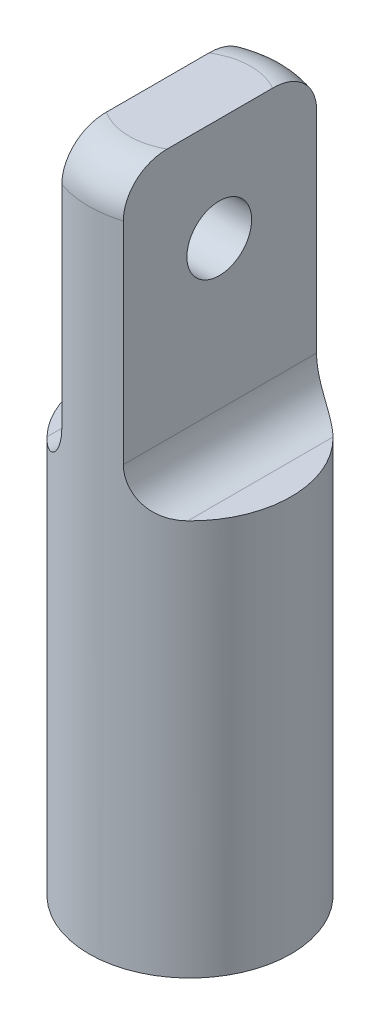
ISO-10303-21;
HEADER;
FILE_DESCRIPTION(('STEP AP214'),'2;1');
FILE_NAME('part.step','',(''),(''),'','','');
FILE_SCHEMA(('AUTOMOTIVE_DESIGN { 1 0 10303 214 1 1 1 1 }'));
ENDSEC;
DATA;
#1=APPLICATION_CONTEXT('core data for automotive mechanical design processes');
#2=APPLICATION_PROTOCOL_DEFINITION('international standard','automotive_design',2000,#1);
#3=PRODUCT_CONTEXT('',#1,'mechanical');
#4=PRODUCT('Part','Part','',(#3));
#5=PRODUCT_RELATED_PRODUCT_CATEGORY('part','',(#4));
#6=PRODUCT_DEFINITION_FORMATION('','',#4);
#7=PRODUCT_DEFINITION_CONTEXT('part definition',#1,'design');
#8=PRODUCT_DEFINITION('design','',#6,#7);
#9=PRODUCT_DEFINITION_SHAPE('','',#8);
#10=(LENGTH_UNIT() NAMED_UNIT(*) SI_UNIT(.MILLI.,.METRE.));
#11=(NAMED_UNIT(*) PLANE_ANGLE_UNIT() SI_UNIT($,.RADIAN.));
#12=(NAMED_UNIT(*) SI_UNIT($,.STERADIAN.) SOLID_ANGLE_UNIT());
#13=UNCERTAINTY_MEASURE_WITH_UNIT(LENGTH_MEASURE(1.E-05),#10,'distance_accuracy_value','');
#14=(GEOMETRIC_REPRESENTATION_CONTEXT(3) GLOBAL_UNCERTAINTY_ASSIGNED_CONTEXT((#13)) GLOBAL_UNIT_ASSIGNED_CONTEXT((#10,
#11,#12)) REPRESENTATION_CONTEXT('',''));
#15=CARTESIAN_POINT('',(0.,0.,0.));
#16=DIRECTION('',(0.,0.,1.));
#17=DIRECTION('',(1.,0.,0.));
#18=AXIS2_PLACEMENT_3D('',#15,#16,#17);
#19=CARTESIAN_POINT('',(0.,60.,0.));
#20=DIRECTION('',(0.,-1.,0.));
#21=DIRECTION('',(0.,0.,-1.));
#22=AXIS2_PLACEMENT_3D('',#19,#20,#21);
#23=CYLINDRICAL_SURFACE('',#22,12.5);
#24=CARTESIAN_POINT('',(0.,23.9298715770072,0.));
#25=DIRECTION('',(0.,-1.,0.));
#26=DIRECTION('',(0.,0.,-1.));
#27=AXIS2_PLACEMENT_3D('',#24,#25,#26);
#28=CIRCLE('',#27,12.5);
#29=CARTESIAN_POINT('',(-9.,23.9298715770072,8.67467578644874));
#30=VERTEX_POINT('',#29);
#31=CARTESIAN_POINT('',(-9.,23.9298715770072,-8.67467578644874));
#32=VERTEX_POINT('',#31);
#33=EDGE_CURVE('E124',#30,#32,#28,.T.);
#34=ORIENTED_EDGE('',*,*,#33,.T.);
#35=CARTESIAN_POINT('',(-9.,23.9298715770072,-8.67467578644874));
#36=CARTESIAN_POINT('',(-8.9263776286709,23.9298733845166,-8.75106038808621));
#37=CARTESIAN_POINT('',(-8.85178659319491,23.9314980512666,-8.82650063151235));
#38=CARTESIAN_POINT('',(-8.70077508893554,23.9382601700447,-8.97539753684047));
#39=CARTESIAN_POINT('',(-8.62435421897226,23.9433983993322,-9.04885375610449));
#40=CARTESIAN_POINT('',(-8.39219253302534,23.9645164930836,-9.26639666180418));
#41=CARTESIAN_POINT('',(-8.23390243978649,23.9862023240674,-9.40729479585523));
#42=CARTESIAN_POINT('',(-7.91148754098922,24.0470245387056,-9.68004089216879));
#43=CARTESIAN_POINT('',(-7.74733703942433,24.0862495852725,-9.81183889429091));
#44=CARTESIAN_POINT('',(-7.41646419139906,24.1841256707728,-10.0642556027873));
#45=CARTESIAN_POINT('',(-7.24974537887247,24.2427519562735,-10.1848883049295));
#46=CARTESIAN_POINT('',(-6.97038575234441,24.3587001142686,-10.3770196577235));
#47=CARTESIAN_POINT('',(-6.85763605260495,24.4103509869452,-10.4518220596143));
#48=CARTESIAN_POINT('',(-6.63341494727138,24.52362167251,-10.5955422155376));
#49=CARTESIAN_POINT('',(-6.52194322012928,24.5852389160916,-10.6644614792517));
#50=CARTESIAN_POINT('',(-6.30183264021777,24.7184126172311,-10.7959852263683));
#51=CARTESIAN_POINT('',(-6.19318591623376,24.789936894004,-10.8586090659511));
#52=CARTESIAN_POINT('',(-5.97964177064672,24.943056427888,-10.9776512848146));
#53=CARTESIAN_POINT('',(-5.87474431470996,25.024651592745,-11.0340697209308));
#54=CARTESIAN_POINT('',(-5.66947900461495,25.1981453180612,-11.1409366681128));
#55=CARTESIAN_POINT('',(-5.56913759932905,25.2900953482511,-11.1913525417588));
#56=CARTESIAN_POINT('',(-5.37488384435961,25.4835228694597,-11.2859336521199));
#57=CARTESIAN_POINT('',(-5.28097166513934,25.5850006129254,-11.3300987231354));
#58=CARTESIAN_POINT('',(-5.10073662928502,25.796962712423,-11.4123754806352));
#59=CARTESIAN_POINT('',(-5.0144214869899,25.9074560087962,-11.4504810450069));
#60=CARTESIAN_POINT('',(-4.85063397819677,26.1365604136835,-11.5208201952544));
#61=CARTESIAN_POINT('',(-4.77316097045812,26.2551709325293,-11.5530542070425));
#62=CARTESIAN_POINT('',(-4.63319717602147,26.4909218397659,-11.6098570236937));
#63=CARTESIAN_POINT('',(-4.57003411443302,26.6075722274275,-11.6348068533955));
#64=CARTESIAN_POINT('',(-4.45289331364862,26.8462467285879,-11.6801407260773));
#65=CARTESIAN_POINT('',(-4.39891537283466,26.9682707240593,-11.7005248692796));
#66=CARTESIAN_POINT('',(-4.30075052515054,27.2167226962583,-11.7369624802365));
#67=CARTESIAN_POINT('',(-4.25655668076468,27.3431474784779,-11.7530190182924));
#68=CARTESIAN_POINT('',(-4.1783729237732,27.5995032319306,-11.7810406096392));
#69=CARTESIAN_POINT('',(-4.14438072944731,27.7294334120437,-11.793006577918));
#70=CARTESIAN_POINT('',(-4.07730247440564,28.0359073911204,-11.8163993687306));
#71=CARTESIAN_POINT('',(-4.04832768862355,28.2134973773019,-11.8263052453573));
#72=CARTESIAN_POINT('',(-4.01934278902278,28.4813947760255,-11.8361720856194));
#73=CARTESIAN_POINT('',(-4.01209404850449,28.5708995523989,-11.8386290540291));
#74=CARTESIAN_POINT('',(-4.00242231847357,28.7502188599393,-11.8419015016659));
#75=CARTESIAN_POINT('',(-4.00000037337114,28.8400334539335,-11.8427166256351));
#76=CARTESIAN_POINT('',(-4.,28.9298715770072,-11.842719282327));
#77=B_SPLINE_CURVE_WITH_KNOTS('',3,(#35,#36,#37,#38,#39,#40,#41,#42,#43,#44,#45,#46,#47,#48,#49,
#50,#51,#52,#53,#54,#55,#56,#57,#58,#59,#60,#61,#62,#63,#64,#65,#66,#67,#68,#69,#70,#71,#72,#73,
#74,#75,#76),.UNSPECIFIED.,.F.,.F.,(4,2,2,2,2,2,2,2,2,2,2,2,2,2,2,2,2,2,2,2,4),(0.,
0.318225508354788,0.636521436349002,1.27462025093567,1.91598185603016,2.55652830265592,
2.99060078067971,3.4245615336866,3.85714435038648,4.2897232047149,4.72455597182784,
5.1594002635519,5.59468113861364,6.02993042657645,6.43437729913267,6.83881529273181,
7.242965590299,7.64702542736879,8.18632490099502,8.45569766724423,8.72512871338911),.UNSPECIFIED.);
#78=CARTESIAN_POINT('',(-4.,28.9298715770072,-11.842719282327));
#79=VERTEX_POINT('',#78);
#80=EDGE_CURVE('E11',#32,#79,#77,.T.);
#81=ORIENTED_EDGE('',*,*,#80,.T.);
#82=DIRECTION('',(0.,-1.,0.));
#83=VECTOR('',#82,1.);
#84=CARTESIAN_POINT('',(-4.,60.,-11.842719282327));
#85=LINE('',#84,#83);
#86=CARTESIAN_POINT('',(-4.,55.,-11.842719282327));
#87=VERTEX_POINT('',#86);
#88=EDGE_CURVE('E214',#79,#87,#85,.F.);
#89=ORIENTED_EDGE('',*,*,#88,.T.);
#90=CARTESIAN_POINT('',(0.,55.,0.));
#91=DIRECTION('',(0.,1.,0.));
#92=DIRECTION('',(0.,0.,1.));
#93=AXIS2_PLACEMENT_3D('',#90,#91,#92);
#94=CIRCLE('',#93,12.5);
#95=CARTESIAN_POINT('',(3.7,55.,-11.9398492452794));
#96=VERTEX_POINT('',#95);
#97=EDGE_CURVE('E208',#87,#96,#94,.F.);
#98=ORIENTED_EDGE('',*,*,#97,.T.);
#99=DIRECTION('',(0.,-1.,0.));
#100=VECTOR('',#99,1.);
#101=CARTESIAN_POINT('',(3.7,60.,-11.9398492452794));
#102=LINE('',#101,#100);
#103=CARTESIAN_POINT('',(3.7,28.9298715770072,-11.9398492452794));
#104=VERTEX_POINT('',#103);
#105=EDGE_CURVE('E107',#96,#104,#102,.T.);
#106=ORIENTED_EDGE('',*,*,#105,.T.);
#107=CARTESIAN_POINT('',(3.70000000000001,28.9298715770072,-11.9398492452794));
#108=CARTESIAN_POINT('',(3.69998254426012,28.7959133069355,-11.939837735073));
#109=CARTESIAN_POINT('',(3.70538271543379,28.66195636816,-11.9381806750743));
#110=CARTESIAN_POINT('',(3.72689327747125,28.3949928393684,-11.9314919996536));
#111=CARTESIAN_POINT('',(3.74300342747761,28.2619862280484,-11.9264604601205));
#112=CARTESIAN_POINT('',(3.78579746958281,27.9979356040187,-11.9129429947619));
#113=CARTESIAN_POINT('',(3.81247569841819,27.8668905790964,-11.9044589190285));
#114=CARTESIAN_POINT('',(3.87615519638713,27.6076251008947,-11.8838776131612));
#115=CARTESIAN_POINT('',(3.91315626734017,27.4794045934404,-11.8717804523919));
#116=CARTESIAN_POINT('',(3.9971564131156,27.226636833657,-11.8437619890964));
#117=CARTESIAN_POINT('',(4.04416058524385,27.1020914910737,-11.8278387363628));
#118=CARTESIAN_POINT('',(4.14771763977735,26.857588409734,-11.7919227177254));
#119=CARTESIAN_POINT('',(4.2042740187822,26.7376323706918,-11.7719284610717));
#120=CARTESIAN_POINT('',(4.32631664547795,26.5032821393582,-11.7276252139234));
#121=CARTESIAN_POINT('',(4.3917972825136,26.3888845133239,-11.7033189315132));
#122=CARTESIAN_POINT('',(4.5310370369512,26.1663641289801,-11.6501182397625));
#123=CARTESIAN_POINT('',(4.60479627841436,26.0582414647425,-11.6212237616615));
#124=CARTESIAN_POINT('',(4.7595288529976,25.8493651300073,-11.5587118496423));
#125=CARTESIAN_POINT('',(4.84047560649312,25.7485866280362,-11.5251115718656));
#126=CARTESIAN_POINT('',(5.00893126588728,25.5545916158157,-11.4529036658191));
#127=CARTESIAN_POINT('',(5.09644027557265,25.461375225215,-11.4142959583461));
#128=CARTESIAN_POINT('',(5.27705186193577,25.283019219247,-11.3319270440355));
#129=CARTESIAN_POINT('',(5.37015367037298,25.1978784987105,-11.2881665442087));
#130=CARTESIAN_POINT('',(5.56098522849963,25.0359984056799,-11.1953874981363));
#131=CARTESIAN_POINT('',(5.65871658114972,24.9592619740486,-11.1463671231375));
#132=CARTESIAN_POINT('',(5.85937852284285,24.8132567553061,-11.0422220269845));
#133=CARTESIAN_POINT('',(5.96236813967217,24.7441313079484,-10.9870102749308));
#134=CARTESIAN_POINT('',(6.1709884532824,24.6148785114127,-10.8712068936944));
#135=CARTESIAN_POINT('',(6.27662009689858,24.5547544436262,-10.8106133153666));
#136=CARTESIAN_POINT('',(6.48945240639738,24.443458596731,-10.6842091505349));
#137=CARTESIAN_POINT('',(6.59665304707263,24.3922866739687,-10.6183986477709));
#138=CARTESIAN_POINT('',(6.81169920558704,24.2986643968336,-10.481745661519));
#139=CARTESIAN_POINT('',(6.91954493922803,24.2562171509249,-10.410901396637));
#140=CARTESIAN_POINT('',(7.14481011976381,24.1762474172013,-10.257771930225));
#141=CARTESIAN_POINT('',(7.26220542987968,24.1395274446115,-10.1750325962223));
#142=CARTESIAN_POINT('',(7.49575488065973,24.075547426575,-10.0042292208186));
#143=CARTESIAN_POINT('',(7.61190844847687,24.0482915788723,-9.91616283692587));
#144=CARTESIAN_POINT('',(7.8420280469592,24.0026373328842,-9.73519454108867));
#145=CARTESIAN_POINT('',(7.9559954204926,23.9842333184353,-9.64229573671417));
#146=CARTESIAN_POINT('',(8.18116140653254,23.9555689526273,-9.45200104373899));
#147=CARTESIAN_POINT('',(8.29236003376113,23.9453085579577,-9.35460517905806));
#148=CARTESIAN_POINT('',(8.4523463159924,23.9357527424014,-9.20936970763336));
#149=CARTESIAN_POINT('',(8.50244491620751,23.9335281007543,-9.16313704115901));
#150=CARTESIAN_POINT('',(8.60182326566338,23.9305888743923,-9.06991015279239));
#151=CARTESIAN_POINT('',(8.65110419532865,23.929871882669,-9.02291726569455));
#152=CARTESIAN_POINT('',(8.7,23.9298715770072,-8.97552226892675));
#153=B_SPLINE_CURVE_WITH_KNOTS('',3,(#107,#108,#109,#110,#111,#112,#113,#114,#115,#116,#117,
#118,#119,#120,#121,#122,#123,#124,#125,#126,#127,#128,#129,#130,#131,#132,#133,#134,#135,#136,
#137,#138,#139,#140,#141,#142,#143,#144,#145,#146,#147,#148,#149,#150,#151,#152),.UNSPECIFIED.,
.F.,.F.,(4,2,2,2,2,2,2,2,2,2,2,2,2,2,2,2,2,2,2,2,2,2,4),(0.,0.401754033588934,0.803499032410172,
1.20502903315927,1.60655132576401,2.00827871513673,2.41015347740028,2.81177673775279,
3.21340601754006,3.61360743477968,4.0138151828233,4.41396808249911,4.81426056091269,
5.22112710948098,5.62814161919765,6.03514959701707,6.44230233492526,6.88659784361665,
7.33109016539247,7.77530009986036,8.21950767185873,8.42410944653236,8.62838431955752),.UNSPECIFIED.);
#154=CARTESIAN_POINT('',(8.7,23.9298715770072,-8.97552226892675));
#155=VERTEX_POINT('',#154);
#156=EDGE_CURVE('E178',#104,#155,#153,.T.);
#157=ORIENTED_EDGE('',*,*,#156,.T.);
#158=CARTESIAN_POINT('',(0.,23.9298715770072,0.));
#159=DIRECTION('',(0.,-1.,0.));
#160=DIRECTION('',(0.,0.,-1.));
#161=AXIS2_PLACEMENT_3D('',#158,#159,#160);
#162=CIRCLE('',#161,12.5);
#163=CARTESIAN_POINT('',(8.7,23.9298715770072,8.97552226892675));
#164=VERTEX_POINT('',#163);
#165=EDGE_CURVE('E123',#155,#164,#162,.T.);
#166=ORIENTED_EDGE('',*,*,#165,.T.);
#167=CARTESIAN_POINT('',(8.7,23.9298715770072,8.97552226892675));
#168=CARTESIAN_POINT('',(8.62364102213998,23.9298734219194,9.04953860199728));
#169=CARTESIAN_POINT('',(8.54634181164902,23.9316212830922,9.12257274201234));
#170=CARTESIAN_POINT('',(8.38998285871638,23.9388773952926,9.26657913243975));
#171=CARTESIAN_POINT('',(8.31092265696786,23.9443866387531,9.33755083352828));
#172=CARTESIAN_POINT('',(8.07095811360933,23.9669940639634,9.54750378848877));
#173=CARTESIAN_POINT('',(7.90763816557626,23.9901745543559,9.68316600437906));
#174=CARTESIAN_POINT('',(7.57589575151173,24.0549286043753,9.94487970211209));
#175=CARTESIAN_POINT('',(7.40745572903827,24.0965742147966,10.0708912457416));
#176=CARTESIAN_POINT('',(7.06881155156239,24.2001261623261,10.3113972878134));
#177=CARTESIAN_POINT('',(6.89861006473031,24.2620052588984,10.4259070018203));
#178=CARTESIAN_POINT('',(6.61590632888215,24.383252164033,10.6065023903419));
#179=CARTESIAN_POINT('',(6.50301016053246,24.436631806527,10.6760421593893));
#180=CARTESIAN_POINT('',(6.27892120001095,24.5533062739628,10.8093535943669));
#181=CARTESIAN_POINT('',(6.16772835850489,24.6166008111366,10.8731254276198));
#182=CARTESIAN_POINT('',(5.94861522952484,24.7529730227351,10.994526896478));
#183=CARTESIAN_POINT('',(5.84068561304893,24.8260187611093,11.052175523891));
#184=CARTESIAN_POINT('',(5.62897381672357,24.9819506304552,11.1614894723693));
#185=CARTESIAN_POINT('',(5.52519161043461,25.0648366986818,11.2131548315815));
#186=CARTESIAN_POINT('',(5.32258514452224,25.2405454046204,11.3107378105132));
#187=CARTESIAN_POINT('',(5.22378469437263,25.3334101354864,11.3566291554831));
#188=CARTESIAN_POINT('',(5.03286533715792,25.5282939197531,11.4425184191955));
#189=CARTESIAN_POINT('',(4.94074659435681,25.6303131980726,11.4825161930745));
#190=CARTESIAN_POINT('',(4.76425199857186,25.8429635332482,11.556863189446));
#191=CARTESIAN_POINT('',(4.67988461685286,25.9536037734111,11.5912062637689));
#192=CARTESIAN_POINT('',(4.52005382329858,26.1825923671757,11.6544628532754));
#193=CARTESIAN_POINT('',(4.44458986444273,26.300940246531,11.6833767020918));
#194=CARTESIAN_POINT('',(4.30763785200231,26.5372391069122,11.734533738865));
#195=CARTESIAN_POINT('',(4.24558797653553,26.6548017138087,11.7570698039816));
#196=CARTESIAN_POINT('',(4.13081548082958,26.8951032256385,11.7978843484909));
#197=CARTESIAN_POINT('',(4.07809269716921,27.0178420398321,11.8161629024818));
#198=CARTESIAN_POINT('',(3.98253938038801,27.2675190942316,11.8487100214569));
#199=CARTESIAN_POINT('',(3.93970121974876,27.3944540094327,11.8629816802377));
#200=CARTESIAN_POINT('',(3.8642892249018,27.651643713965,11.8877600585756));
#201=CARTESIAN_POINT('',(3.83171287600078,27.7818976814808,11.898267700605));
#202=CARTESIAN_POINT('',(3.76975851680694,28.0803141175217,11.9180650347381));
#203=CARTESIAN_POINT('',(3.74360500150091,28.2492379703302,11.9262644722699));
#204=CARTESIAN_POINT('',(3.71744789746602,28.5038885943099,11.9344312854467));
#205=CARTESIAN_POINT('',(3.71090773359722,28.5889372589596,11.936464847696));
#206=CARTESIAN_POINT('',(3.7021840445685,28.7592746944461,11.939172741496));
#207=CARTESIAN_POINT('',(3.70000028144622,28.8445634519132,11.939847147289));
#208=CARTESIAN_POINT('',(3.7,28.9298715770072,11.9398492452794));
#209=B_SPLINE_CURVE_WITH_KNOTS('',3,(#167,#168,#169,#170,#171,#172,#173,#174,#175,#176,#177,
#178,#179,#180,#181,#182,#183,#184,#185,#186,#187,#188,#189,#190,#191,#192,#193,#194,#195,#196,
#197,#198,#199,#200,#201,#202,#203,#204,#205,#206,#207,#208),.UNSPECIFIED.,.F.,.F.,(4,2,2,2,2,2,
2,2,2,2,2,2,2,2,2,2,2,2,2,2,4),(0.,0.31898774542742,0.638059687640619,1.27773670819027,
1.91993201695989,2.56126626756416,2.98965506875094,3.41803143876768,3.84503776649089,
4.27204137163668,4.70092272239989,5.12981461326864,5.55916978819854,5.98849857007091,
6.39250258165064,6.79649951392216,7.20018364955905,7.6037687838739,8.11605232168646,
8.37192137872393,8.62777645888593),.UNSPECIFIED.);
#210=CARTESIAN_POINT('',(3.7,28.9298715770072,11.9398492452794));
#211=VERTEX_POINT('',#210);
#212=EDGE_CURVE('E171',#164,#211,#209,.T.);
#213=ORIENTED_EDGE('',*,*,#212,.T.);
#214=DIRECTION('',(0.,-1.,0.));
#215=VECTOR('',#214,1.);
#216=CARTESIAN_POINT('',(3.7,60.,11.9398492452794));
#217=LINE('',#216,#215);
#218=CARTESIAN_POINT('',(3.7,55.,11.9398492452794));
#219=VERTEX_POINT('',#218);
#220=EDGE_CURVE('E198',#211,#219,#217,.F.);
#221=ORIENTED_EDGE('',*,*,#220,.T.);
#222=CARTESIAN_POINT('',(0.,55.,0.));
#223=DIRECTION('',(0.,1.,0.));
#224=DIRECTION('',(0.,0.,1.));
#225=AXIS2_PLACEMENT_3D('',#222,#223,#224);
#226=CIRCLE('',#225,12.5);
#227=CARTESIAN_POINT('',(-4.,55.,11.842719282327));
#228=VERTEX_POINT('',#227);
#229=EDGE_CURVE('E209',#219,#228,#226,.F.);
#230=ORIENTED_EDGE('',*,*,#229,.T.);
#231=DIRECTION('',(0.,-1.,0.));
#232=VECTOR('',#231,1.);
#233=CARTESIAN_POINT('',(-4.,60.,11.842719282327));
#234=LINE('',#233,#232);
#235=CARTESIAN_POINT('',(-4.,28.9298715770072,11.842719282327));
#236=VERTEX_POINT('',#235);
#237=EDGE_CURVE('E219',#228,#236,#234,.T.);
#238=ORIENTED_EDGE('',*,*,#237,.T.);
#239=CARTESIAN_POINT('',(-4.,28.9298715770072,11.842719282327));
#240=CARTESIAN_POINT('',(-3.99998214798321,28.7968520803759,11.8427084588404));
#241=CARTESIAN_POINT('',(-4.00530750703669,28.6638340263056,11.8409260821642));
#242=CARTESIAN_POINT('',(-4.02651670644689,28.3987444697547,11.8337396987262));
#243=CARTESIAN_POINT('',(-4.04240024367654,28.2666729402094,11.8283357959389));
#244=CARTESIAN_POINT('',(-4.08458004583597,28.0045231456539,11.8138339738672));
#245=CARTESIAN_POINT('',(-4.11086750170455,27.874443290813,11.8047391795181));
#246=CARTESIAN_POINT('',(-4.17359931095343,27.617090648242,11.7827068381292));
#247=CARTESIAN_POINT('',(-4.2100434764518,27.4898178086338,11.7697693621723));
#248=CARTESIAN_POINT('',(-4.2927545195891,27.2389264472384,11.7398547572266));
#249=CARTESIAN_POINT('',(-4.33902592753988,27.1153096409107,11.7228757646805));
#250=CARTESIAN_POINT('',(-4.44093507236373,26.8726276245625,11.6846504788551));
#251=CARTESIAN_POINT('',(-4.49657623814669,26.7535641004832,11.6634026228122));
#252=CARTESIAN_POINT('',(-4.6166131720211,26.5209203320247,11.6164122127301));
#253=CARTESIAN_POINT('',(-4.68100558674041,26.4073380097972,11.5906713792761));
#254=CARTESIAN_POINT('',(-4.81787504036079,26.1863848814623,11.5344506060753));
#255=CARTESIAN_POINT('',(-4.89035223747057,26.0790141969712,11.503970573584));
#256=CARTESIAN_POINT('',(-5.04247276267362,25.8713560998491,11.4381083981435));
#257=CARTESIAN_POINT('',(-5.12210424857555,25.7710574551108,11.4027343055583));
#258=CARTESIAN_POINT('',(-5.28775189909089,25.5779471616156,11.3268696282069));
#259=CARTESIAN_POINT('',(-5.37376818337957,25.4851356532641,11.2863789475264));
#260=CARTESIAN_POINT('',(-5.55115473426632,25.3075512332366,11.2001961419512));
#261=CARTESIAN_POINT('',(-5.64252061770265,25.2227718855501,11.1545082472048));
#262=CARTESIAN_POINT('',(-5.82969662583565,25.0614810343417,11.0578358775996));
#263=CARTESIAN_POINT('',(-5.92550825177579,24.9849723531376,11.0068496062678));
#264=CARTESIAN_POINT('',(-6.12266266884401,24.8388677595159,10.8984370448365));
#265=CARTESIAN_POINT('',(-6.22408065101798,24.7694600137287,10.8408941379751));
#266=CARTESIAN_POINT('',(-6.42942341221396,24.6395446398447,10.7203867823564));
#267=CARTESIAN_POINT('',(-6.53334916981243,24.579040553681,10.6574201917288));
#268=CARTESIAN_POINT('',(-6.74289057483144,24.4667313541462,10.5260983617965));
#269=CARTESIAN_POINT('',(-6.8485096235325,24.4149470471844,10.4577307900706));
#270=CARTESIAN_POINT('',(-7.06025563904037,24.3200057899532,10.3159604774226));
#271=CARTESIAN_POINT('',(-7.16638270593655,24.2768506180048,10.2425567028007));
#272=CARTESIAN_POINT('',(-7.42295704144786,24.1823789701526,10.0590232693064));
#273=CARTESIAN_POINT('',(-7.57323092473774,24.1352892850864,9.94645449421916));
#274=CARTESIAN_POINT('',(-7.87106620616477,24.0565490841476,9.7124795116523));
#275=CARTESIAN_POINT('',(-8.01862499749913,24.0249127296848,9.59106531486651));
#276=CARTESIAN_POINT('',(-8.30859288217087,23.9757330835394,9.34096990583171));
#277=CARTESIAN_POINT('',(-8.4510228892827,23.9581243641228,9.21232546306423));
#278=CARTESIAN_POINT('',(-8.73006581467514,23.935205974591,8.9483515665845));
#279=CARTESIAN_POINT('',(-8.86668968315878,23.9298720429255,8.81303584086371));
#280=CARTESIAN_POINT('',(-9.,23.9298715770072,8.67467578644874));
#281=B_SPLINE_CURVE_WITH_KNOTS('',3,(#239,#240,#241,#242,#243,#244,#245,#246,#247,#248,#249,
#250,#251,#252,#253,#254,#255,#256,#257,#258,#259,#260,#261,#262,#263,#264,#265,#266,#267,#268,
#269,#270,#271,#272,#273,#274,#275,#276,#277,#278,#279,#280),.UNSPECIFIED.,.F.,.F.,(4,2,2,2,2,2,
2,2,2,2,2,2,2,2,2,2,2,2,2,2,4),(0.,0.398938094758551,0.797864736432431,1.19645432464244,
1.59503654010842,1.99380290046146,2.39271550976731,2.79147568935197,3.19024367352534,
3.58836334491183,3.98649048045067,4.38429585771944,4.78223655811255,5.18889536467681,
5.59571550793623,6.00349302301198,6.41135448782441,6.99112573710733,7.57142729578971,
8.1490060983387,8.72544231188466),.UNSPECIFIED.);
#282=EDGE_CURVE('E44',#236,#30,#281,.T.);
#283=ORIENTED_EDGE('',*,*,#282,.T.);
#284=EDGE_LOOP('',(#34,#81,#89,#98,#106,#157,#166,#213,#221,#230,#238,#283));
#285=FACE_BOUND('',#284,.T.);
#286=CARTESIAN_POINT('',(0.,-25.,0.));
#287=DIRECTION('',(0.,1.,0.));
#288=DIRECTION('',(0.,0.,1.));
#289=AXIS2_PLACEMENT_3D('',#286,#287,#288);
#290=CIRCLE('',#289,12.5);
#291=CARTESIAN_POINT('',(0.,-25.,12.5));
#292=VERTEX_POINT('',#291);
#293=EDGE_CURVE('E221',#292,#292,#290,.T.);
#294=ORIENTED_EDGE('',*,*,#293,.T.);
#295=EDGE_LOOP('',(#294));
#296=FACE_BOUND('',#295,.T.);
#297=ADVANCED_FACE('F31',(#285,#296),#23,.T.);
#298=CARTESIAN_POINT('',(0.,60.,0.));
#299=DIRECTION('',(0.,1.,0.));
#300=DIRECTION('',(0.,0.,1.));
#301=AXIS2_PLACEMENT_3D('',#298,#299,#300);
#302=PLANE('',#301);
#303=DIRECTION('',(0.,0.,1.));
#304=VECTOR('',#303,1.);
#305=CARTESIAN_POINT('',(3.7,60.,0.));
#306=LINE('',#305,#304);
#307=CARTESIAN_POINT('',(3.7,60.,-6.52380257212004));
#308=VERTEX_POINT('',#307);
#309=CARTESIAN_POINT('',(3.7,60.,6.52380257212004));
#310=VERTEX_POINT('',#309);
#311=EDGE_CURVE('E105',#308,#310,#306,.T.);
#312=ORIENTED_EDGE('',*,*,#311,.F.);
#313=CARTESIAN_POINT('',(0.,60.,0.));
#314=DIRECTION('',(0.,1.,0.));
#315=DIRECTION('',(0.,0.,1.));
#316=AXIS2_PLACEMENT_3D('',#313,#314,#315);
#317=CIRCLE('',#316,7.5);
#318=CARTESIAN_POINT('',(-4.,60.,-6.34428877022476));
#319=VERTEX_POINT('',#318);
#320=EDGE_CURVE('E119',#308,#319,#317,.T.);
#321=ORIENTED_EDGE('',*,*,#320,.T.);
#322=DIRECTION('',(0.,0.,-1.));
#323=VECTOR('',#322,1.);
#324=CARTESIAN_POINT('',(-4.,60.,0.));
#325=LINE('',#324,#323);
#326=CARTESIAN_POINT('',(-4.,60.,6.34428877022476));
#327=VERTEX_POINT('',#326);
#328=EDGE_CURVE('E216',#327,#319,#325,.T.);
#329=ORIENTED_EDGE('',*,*,#328,.F.);
#330=CARTESIAN_POINT('',(0.,60.,0.));
#331=DIRECTION('',(0.,1.,0.));
#332=DIRECTION('',(0.,0.,1.));
#333=AXIS2_PLACEMENT_3D('',#330,#331,#332);
#334=CIRCLE('',#333,7.5);
#335=EDGE_CURVE('E122',#327,#310,#334,.T.);
#336=ORIENTED_EDGE('',*,*,#335,.T.);
#337=EDGE_LOOP('',(#312,#321,#329,#336));
#338=FACE_BOUND('',#337,.T.);
#339=ADVANCED_FACE('F117',(#338),#302,.T.);
#340=CARTESIAN_POINT('',(0.,-25.,0.));
#341=DIRECTION('',(0.,1.,0.));
#342=DIRECTION('',(0.,0.,1.));
#343=AXIS2_PLACEMENT_3D('',#340,#341,#342);
#344=PLANE('',#343);
#345=ORIENTED_EDGE('',*,*,#293,.F.);
#346=EDGE_LOOP('',(#345));
#347=FACE_BOUND('',#346,.T.);
#348=ADVANCED_FACE('F160',(#347),#344,.F.);
#349=CARTESIAN_POINT('',(-16.0544313510632,23.9298715770072,-30.));
#350=DIRECTION('',(0.,-1.,0.));
#351=DIRECTION('',(0.,0.,-1.));
#352=AXIS2_PLACEMENT_3D('',#349,#350,#351);
#353=PLANE('',#352);
#354=ORIENTED_EDGE('',*,*,#33,.F.);
#355=DIRECTION('',(0.,0.,1.));
#356=VECTOR('',#355,1.);
#357=CARTESIAN_POINT('',(-9.,23.9298715770072,-11.842719282327));
#358=LINE('',#357,#356);
#359=EDGE_CURVE('E50',#30,#32,#358,.F.);
#360=ORIENTED_EDGE('',*,*,#359,.T.);
#361=EDGE_LOOP('',(#354,#360));
#362=FACE_BOUND('',#361,.T.);
#363=ADVANCED_FACE('F153',(#362),#353,.F.);
#364=CARTESIAN_POINT('',(-4.,65.9298715770072,-30.));
#365=DIRECTION('',(1.,0.,0.));
#366=DIRECTION('',(0.,1.,0.));
#367=AXIS2_PLACEMENT_3D('',#364,#365,#366);
#368=PLANE('',#367);
#369=CARTESIAN_POINT('',(-4.,47.2276333412561,0.0825161081544497));
#370=DIRECTION('',(-1.,0.,0.));
#371=DIRECTION('',(0.,-1.,0.));
#372=AXIS2_PLACEMENT_3D('',#369,#370,#371);
#373=CIRCLE('',#372,4.00000000000001);
#374=CARTESIAN_POINT('',(-4.,43.2276333412561,0.0825161081544497));
#375=VERTEX_POINT('',#374);
#376=EDGE_CURVE('E199',#375,#375,#373,.T.);
#377=ORIENTED_EDGE('',*,*,#376,.F.);
#378=EDGE_LOOP('',(#377));
#379=FACE_BOUND('',#378,.T.);
#380=ORIENTED_EDGE('',*,*,#88,.F.);
#381=DIRECTION('',(0.,0.,1.));
#382=VECTOR('',#381,1.);
#383=CARTESIAN_POINT('',(-4.,28.9298715770072,11.842719282327));
#384=LINE('',#383,#382);
#385=EDGE_CURVE('E188',#79,#236,#384,.T.);
#386=ORIENTED_EDGE('',*,*,#385,.T.);
#387=ORIENTED_EDGE('',*,*,#237,.F.);
#388=CARTESIAN_POINT('',(-4.,55.,11.842719282327));
#389=CARTESIAN_POINT('',(-4.,55.1345845252974,11.8427368770055));
#390=CARTESIAN_POINT('',(-4.,55.2691653283578,11.836984577286));
#391=CARTESIAN_POINT('',(-4.,55.5373369928431,11.8140681120964));
#392=CARTESIAN_POINT('',(-4.,55.6709279651139,11.7969052445801));
#393=CARTESIAN_POINT('',(-4.,55.9359246565719,11.7513374475244));
#394=CARTESIAN_POINT('',(-4.,56.067333942369,11.7229532483346));
#395=CARTESIAN_POINT('',(-4.,56.3272846204227,11.6551889733668));
#396=CARTESIAN_POINT('',(-4.,56.4558260141665,11.6158089032908));
#397=CARTESIAN_POINT('',(-4.,56.70913574439,11.5263853064207));
#398=CARTESIAN_POINT('',(-4.,56.833904261518,11.4763422911031));
#399=CARTESIAN_POINT('',(-4.,57.0788677606751,11.3659884879281));
#400=CARTESIAN_POINT('',(-4.,57.1990610379988,11.3056739178961));
#401=CARTESIAN_POINT('',(-4.,57.4340015950731,11.1753002655569));
#402=CARTESIAN_POINT('',(-4.,57.548750132965,11.1052434492883));
#403=CARTESIAN_POINT('',(-4.,57.7721424584815,10.9559120492508));
#404=CARTESIAN_POINT('',(-4.,57.8807839167176,10.8766339831869));
#405=CARTESIAN_POINT('',(-4.,58.0928279383644,10.708260521902));
#406=CARTESIAN_POINT('',(-4.,58.1961282303343,10.6190363677412));
#407=CARTESIAN_POINT('',(-4.,58.3951533448627,10.4324290659926));
#408=CARTESIAN_POINT('',(-4.,58.4908748719007,10.3350424065336));
#409=CARTESIAN_POINT('',(-4.,58.6741401825063,10.1329380215444));
#410=CARTESIAN_POINT('',(-4.,58.7616874487802,10.0282234517028));
#411=CARTESIAN_POINT('',(-4.,58.9282353798076,9.81220258388224));
#412=CARTESIAN_POINT('',(-4.,59.0072355207776,9.70089588257141));
#413=CARTESIAN_POINT('',(-4.,59.1598443282774,9.46715816741649));
#414=CARTESIAN_POINT('',(-4.,59.233029114111,9.34445040681196));
#415=CARTESIAN_POINT('',(-4.,59.369399556528,9.09365071097472));
#416=CARTESIAN_POINT('',(-4.,59.4325878398843,8.96556020139657));
#417=CARTESIAN_POINT('',(-4.,59.5489377206136,8.7046799599167));
#418=CARTESIAN_POINT('',(-4.,59.6020840926225,8.57188344915808));
#419=CARTESIAN_POINT('',(-4.,59.6981930425298,8.30270283759038));
#420=CARTESIAN_POINT('',(-4.,59.7411582925547,8.16631968858986));
#421=CARTESIAN_POINT('',(-4.,59.8168287289408,7.89143350668288));
#422=CARTESIAN_POINT('',(-4.,59.8495810709406,7.75294340938052));
#423=CARTESIAN_POINT('',(-4.,59.9052892854602,7.47399249732839));
#424=CARTESIAN_POINT('',(-4.,59.9282436721831,7.33353138702049));
#425=CARTESIAN_POINT('',(-4.,59.9645682722139,7.05184926396914));
#426=CARTESIAN_POINT('',(-4.,59.9779691393582,6.91063215990255));
#427=CARTESIAN_POINT('',(-4.,59.9956902333593,6.62769603848238));
#428=CARTESIAN_POINT('',(-4.,60.0000150194499,6.48597730896975));
#429=CARTESIAN_POINT('',(-4.,60.,6.34428877022476));
#430=B_SPLINE_CURVE_WITH_KNOTS('',3,(#388,#389,#390,#391,#392,#393,#394,#395,#396,#397,#398,
#399,#400,#401,#402,#403,#404,#405,#406,#407,#408,#409,#410,#411,#412,#413,#414,#415,#416,#417,
#418,#419,#420,#421,#422,#423,#424,#425,#426,#427,#428,#429),.UNSPECIFIED.,.F.,.F.,(4,2,2,2,2,2,
2,2,2,2,2,2,2,2,2,2,2,2,2,2,4),(0.,0.403625157656878,0.807204410746289,1.21004154748268,
1.61287847531918,2.01569608436326,2.41866234021065,2.82153502272324,3.22456034229546,
3.63359513267118,4.04280682029371,4.45184335689146,4.8609049458174,5.28906356720166,
5.71710949414771,6.14579929834804,6.57437646414748,7.00094442879744,7.42757705677778,
7.85283453524377,8.27787834078144),.UNSPECIFIED.);
#431=EDGE_CURVE('E129',#228,#327,#430,.T.);
#432=ORIENTED_EDGE('',*,*,#431,.T.);
#433=ORIENTED_EDGE('',*,*,#328,.T.);
#434=CARTESIAN_POINT('',(-4.,60.,-6.34428877022476));
#435=CARTESIAN_POINT('',(-4.,60.0000231804137,-6.50226974029518));
#436=CARTESIAN_POINT('',(-4.,59.9946418808225,-6.66029614275031));
#437=CARTESIAN_POINT('',(-4.,59.972543654057,-6.97564059838996));
#438=CARTESIAN_POINT('',(-4.,59.955820076574,-7.13295818146845));
#439=CARTESIAN_POINT('',(-4.,59.9103728977892,-7.44684084831445));
#440=CARTESIAN_POINT('',(-4.,59.8815776151538,-7.60339569018045));
#441=CARTESIAN_POINT('',(-4.,59.8116363791873,-7.91371153554253));
#442=CARTESIAN_POINT('',(-4.,59.7704916879626,-8.06747282283693));
#443=CARTESIAN_POINT('',(-4.,59.6699483393952,-8.3893090681614));
#444=CARTESIAN_POINT('',(-4.,59.6089524385961,-8.55688952100539));
#445=CARTESIAN_POINT('',(-4.,59.4711687604595,-8.88543167104563));
#446=CARTESIAN_POINT('',(-4.,59.3943818693168,-9.04639373905947));
#447=CARTESIAN_POINT('',(-4.,59.2254583123939,-9.35955615524516));
#448=CARTESIAN_POINT('',(-4.,59.1333599709265,-9.51177713342207));
#449=CARTESIAN_POINT('',(-4.,58.9342040384596,-9.80608154180577));
#450=CARTESIAN_POINT('',(-4.,58.8271496464925,-9.94816713013519));
#451=CARTESIAN_POINT('',(-4.,58.6149810595913,-10.2012569224576));
#452=CARTESIAN_POINT('',(-4.,58.5117200689416,-10.3138192991843));
#453=CARTESIAN_POINT('',(-4.,58.2954175273781,-10.5291106600604));
#454=CARTESIAN_POINT('',(-4.,58.1823771970803,-10.631840868058));
#455=CARTESIAN_POINT('',(-4.,57.9472734640634,-10.8264998355838));
#456=CARTESIAN_POINT('',(-4.,57.8252066187631,-10.9184244390382));
#457=CARTESIAN_POINT('',(-4.,57.5730353031683,-11.0904901195509));
#458=CARTESIAN_POINT('',(-4.,57.4429314730663,-11.1706321334465));
#459=CARTESIAN_POINT('',(-4.,57.1866388374799,-11.3122881067973));
#460=CARTESIAN_POINT('',(-4.,57.06099355803,-11.3747874193745));
#461=CARTESIAN_POINT('',(-4.,56.8047345961025,-11.4885853096781));
#462=CARTESIAN_POINT('',(-4.,56.6741213228244,-11.5398848075658));
#463=CARTESIAN_POINT('',(-4.,56.4090755690264,-11.6307590676401));
#464=CARTESIAN_POINT('',(-4.,56.2746484869746,-11.6703495772119));
#465=CARTESIAN_POINT('',(-4.,56.0028807941899,-11.7375240328985));
#466=CARTESIAN_POINT('',(-4.,55.8655414458314,-11.7651130740345));
#467=CARTESIAN_POINT('',(-4.,55.60690930523,-11.8052651670343));
#468=CARTESIAN_POINT('',(-4.,55.4858447076751,-11.8193126217173));
#469=CARTESIAN_POINT('',(-4.,55.2431890256248,-11.838037448486));
#470=CARTESIAN_POINT('',(-4.,55.1215990986431,-11.8427298298552));
#471=CARTESIAN_POINT('',(-4.,55.,-11.842719282327));
#472=B_SPLINE_CURVE_WITH_KNOTS('',3,(#434,#435,#436,#437,#438,#439,#440,#441,#442,#443,#444,
#445,#446,#447,#448,#449,#450,#451,#452,#453,#454,#455,#456,#457,#458,#459,#460,#461,#462,#463,
#464,#465,#466,#467,#468,#469,#470,#471),.UNSPECIFIED.,.F.,.F.,(4,2,2,2,2,2,2,2,2,2,2,2,2,2,2,2,
2,2,4),(0.,0.473917335790704,0.948112783653928,1.42516478750692,1.90216805335979,
2.4363690959543,2.97054016721442,3.50339380907381,4.03613364992861,4.49378690636968,
4.95138312264054,5.40915476858359,5.86688999726063,6.28736170096074,6.70779884628153,
7.12766794838953,7.54735862777646,7.91263476413326,8.27732437816792),.UNSPECIFIED.);
#473=EDGE_CURVE('E128',#319,#87,#472,.T.);
#474=ORIENTED_EDGE('',*,*,#473,.T.);
#475=EDGE_LOOP('',(#380,#386,#387,#432,#433,#474));
#476=FACE_BOUND('',#475,.T.);
#477=ADVANCED_FACE('F147',(#379,#476),#368,.F.);
#478=CARTESIAN_POINT('',(16.0544313510632,23.9298715770072,-30.));
#479=DIRECTION('',(0.,-1.,0.));
#480=DIRECTION('',(0.,0.,-1.));
#481=AXIS2_PLACEMENT_3D('',#478,#479,#480);
#482=PLANE('',#481);
#483=ORIENTED_EDGE('',*,*,#165,.F.);
#484=DIRECTION('',(0.,0.,1.));
#485=VECTOR('',#484,1.);
#486=CARTESIAN_POINT('',(8.7,23.9298715770072,11.9398492452794));
#487=LINE('',#486,#485);
#488=EDGE_CURVE('E111',#155,#164,#487,.T.);
#489=ORIENTED_EDGE('',*,*,#488,.T.);
#490=EDGE_LOOP('',(#483,#489));
#491=FACE_BOUND('',#490,.T.);
#492=ADVANCED_FACE('F152',(#491),#482,.F.);
#493=CARTESIAN_POINT('',(3.7,65.9298715770072,-30.));
#494=DIRECTION('',(-1.,0.,0.));
#495=DIRECTION('',(0.,-1.,0.));
#496=AXIS2_PLACEMENT_3D('',#493,#494,#495);
#497=PLANE('',#496);
#498=CARTESIAN_POINT('',(3.7,47.2276333412561,0.0825161081544497));
#499=DIRECTION('',(-1.,0.,0.));
#500=DIRECTION('',(0.,-1.,0.));
#501=AXIS2_PLACEMENT_3D('',#498,#499,#500);
#502=CIRCLE('',#501,4.00000000000001);
#503=CARTESIAN_POINT('',(3.7,43.2276333412561,0.0825161081544497));
#504=VERTEX_POINT('',#503);
#505=EDGE_CURVE('E196',#504,#504,#502,.T.);
#506=ORIENTED_EDGE('',*,*,#505,.T.);
#507=EDGE_LOOP('',(#506));
#508=FACE_BOUND('',#507,.T.);
#509=ORIENTED_EDGE('',*,*,#220,.F.);
#510=DIRECTION('',(0.,0.,1.));
#511=VECTOR('',#510,1.);
#512=CARTESIAN_POINT('',(3.70000000000001,28.9298715770072,-11.9398492452794));
#513=LINE('',#512,#511);
#514=EDGE_CURVE('E190',#211,#104,#513,.F.);
#515=ORIENTED_EDGE('',*,*,#514,.T.);
#516=ORIENTED_EDGE('',*,*,#105,.F.);
#517=CARTESIAN_POINT('',(3.7,55.,-11.9398492452794));
#518=CARTESIAN_POINT('',(3.7,55.1354748287445,-11.9398664876192));
#519=CARTESIAN_POINT('',(3.7,55.2709461591699,-11.9340856634019));
#520=CARTESIAN_POINT('',(3.7,55.5408965439903,-11.9110531327921));
#521=CARTESIAN_POINT('',(3.7,55.6753757001175,-11.893802619444));
#522=CARTESIAN_POINT('',(3.7,55.9421602076747,-11.8479945180857));
#523=CARTESIAN_POINT('',(3.7,56.0744688385624,-11.8194560209956));
#524=CARTESIAN_POINT('',(3.7,56.3362036970269,-11.7513136261457));
#525=CARTESIAN_POINT('',(3.7,56.4656299310941,-11.7117097533053));
#526=CARTESIAN_POINT('',(3.7,56.7206934757171,-11.6217610224914));
#527=CARTESIAN_POINT('',(3.7,56.8463307743428,-11.5714161307022));
#528=CARTESIAN_POINT('',(3.7,57.0929986302212,-11.4603757853151));
#529=CARTESIAN_POINT('',(3.7,57.2140274707552,-11.39967651982));
#530=CARTESIAN_POINT('',(3.7,57.4505862462265,-11.2684475714331));
#531=CARTESIAN_POINT('',(3.7,57.5661177023795,-11.197920629491));
#532=CARTESIAN_POINT('',(3.7,57.7910126816514,-11.0475550030529));
#533=CARTESIAN_POINT('',(3.7,57.9003738549232,-10.9677128060411));
#534=CARTESIAN_POINT('',(3.7,58.1135612224261,-10.7982809546312));
#535=CARTESIAN_POINT('',(3.7,58.217298573456,-10.7085795422914));
#536=CARTESIAN_POINT('',(3.7,58.417121483554,-10.5209466731117));
#537=CARTESIAN_POINT('',(3.7,58.5132036946481,-10.4230116533715));
#538=CARTESIAN_POINT('',(3.7,58.6970942128582,-10.2197309712058));
#539=CARTESIAN_POINT('',(3.7,58.7849056021268,-10.1143880951109));
#540=CARTESIAN_POINT('',(3.7,58.9518521475471,-9.89703602613568));
#541=CARTESIAN_POINT('',(3.7,59.0309868359135,-9.78502647433793));
#542=CARTESIAN_POINT('',(3.7,59.1832186029123,-9.55053202009755));
#543=CARTESIAN_POINT('',(3.7,59.2559459969705,-9.4278071292512));
#544=CARTESIAN_POINT('',(3.7,59.3913188947331,-9.17696995000038));
#545=CARTESIAN_POINT('',(3.7,59.4539671951481,-9.04885916854112));
#546=CARTESIAN_POINT('',(3.7,59.5691053441763,-8.7879627724134));
#547=CARTESIAN_POINT('',(3.7,59.6215821160867,-8.65517139597101));
#548=CARTESIAN_POINT('',(3.7,59.7161981517417,-8.38600483102806));
#549=CARTESIAN_POINT('',(3.7,59.7583404209622,-8.2496306972673));
#550=CARTESIAN_POINT('',(3.7,59.8301139173606,-7.98245224120163));
#551=CARTESIAN_POINT('',(3.7,59.8603468426542,-7.85180868342833));
#552=CARTESIAN_POINT('',(3.7,59.9118627616538,-7.58876249834529));
#553=CARTESIAN_POINT('',(3.7,59.9331450915381,-7.45635974131535));
#554=CARTESIAN_POINT('',(3.7,59.9668982313729,-7.19083214174023));
#555=CARTESIAN_POINT('',(3.7,59.9793941462398,-7.05771046066023));
#556=CARTESIAN_POINT('',(3.7,59.9959495828489,-6.79098601528122));
#557=CARTESIAN_POINT('',(3.7,60.0000119924956,-6.65738343136283));
#558=CARTESIAN_POINT('',(3.7,60.,-6.52380257212004));
#559=B_SPLINE_CURVE_WITH_KNOTS('',3,(#517,#518,#519,#520,#521,#522,#523,#524,#525,#526,#527,
#528,#529,#530,#531,#532,#533,#534,#535,#536,#537,#538,#539,#540,#541,#542,#543,#544,#545,#546,
#547,#548,#549,#550,#551,#552,#553,#554,#555,#556,#557,#558),.UNSPECIFIED.,.F.,.F.,(4,2,2,2,2,2,
2,2,2,2,2,2,2,2,2,2,2,2,2,2,4),(0.,0.406296020122541,0.812549785098972,1.21811938704968,
1.62368807565216,2.02925804111237,2.43497763809819,2.84058430508988,3.24634441205875,
3.65730203234528,4.06843840935825,4.47942096361083,4.89042566420662,5.31792250566056,
5.74530052148398,6.17322439004928,6.6010236619867,7.00299694761233,7.4050000403682,
7.80584979346406,8.20656226000063),.UNSPECIFIED.);
#560=EDGE_CURVE('E100',#96,#308,#559,.T.);
#561=ORIENTED_EDGE('',*,*,#560,.T.);
#562=ORIENTED_EDGE('',*,*,#311,.T.);
#563=CARTESIAN_POINT('',(3.7,60.,6.52380257212004));
#564=CARTESIAN_POINT('',(3.7,60.0000238918332,6.68210447020455));
#565=CARTESIAN_POINT('',(3.7,59.9943114763027,6.84044830695489));
#566=CARTESIAN_POINT('',(3.7,59.9709703166966,7.15633721898927));
#567=CARTESIAN_POINT('',(3.7,59.9533349617585,7.31388180226376));
#568=CARTESIAN_POINT('',(3.7,59.9055907415834,7.62785131365806));
#569=CARTESIAN_POINT('',(3.7,59.8754233653907,7.78426744104716));
#570=CARTESIAN_POINT('',(3.7,59.802356904471,8.09408350670761));
#571=CARTESIAN_POINT('',(3.7,59.7594594334903,8.24748382465529));
#572=CARTESIAN_POINT('',(3.7,59.6570942780775,8.56152527641231));
#573=CARTESIAN_POINT('',(3.7,59.5966214441923,8.72184083736795));
#574=CARTESIAN_POINT('',(3.7,59.4608940089234,9.03609086880808));
#575=CARTESIAN_POINT('',(3.7,59.3856400947094,9.19002563553176));
#576=CARTESIAN_POINT('',(3.7,59.2208247384679,9.48963294111857));
#577=CARTESIAN_POINT('',(3.7,59.1312932287373,9.63532191968222));
#578=CARTESIAN_POINT('',(3.7,58.9383534335142,9.91718989591199));
#579=CARTESIAN_POINT('',(3.7,58.834947470869,10.0533704796744));
#580=CARTESIAN_POINT('',(3.7,58.6280822082718,10.2991815348788));
#581=CARTESIAN_POINT('',(3.7,58.5260846540822,10.4100451245431));
#582=CARTESIAN_POINT('',(3.7,58.3125757922042,10.6221920321323));
#583=CARTESIAN_POINT('',(3.7,58.2010654487934,10.7234763188876));
#584=CARTESIAN_POINT('',(3.7,57.9692768056105,10.9155571882715));
#585=CARTESIAN_POINT('',(3.7,57.8489952133983,11.0063497992712));
#586=CARTESIAN_POINT('',(3.7,57.600618728537,11.1765275859787));
#587=CARTESIAN_POINT('',(3.7,57.4725243591397,11.2559135244432));
#588=CARTESIAN_POINT('',(3.7,57.2184696274561,11.3975291233644));
#589=CARTESIAN_POINT('',(3.7,57.0929535555449,11.4605571165582));
#590=CARTESIAN_POINT('',(3.7,56.8369296369319,11.5754811081685));
#591=CARTESIAN_POINT('',(3.7,56.7064221477592,11.6273779021457));
#592=CARTESIAN_POINT('',(3.7,56.4415415623552,11.7195296810193));
#593=CARTESIAN_POINT('',(3.7,56.3071734639817,11.7597990325056));
#594=CARTESIAN_POINT('',(3.7,56.0354794409319,11.8284139073503));
#595=CARTESIAN_POINT('',(3.7,55.8981547397211,11.8567642668474));
#596=CARTESIAN_POINT('',(3.7,55.6341870146824,11.8992731637978));
#597=CARTESIAN_POINT('',(3.7,55.5077134820565,11.9144911149676));
#598=CARTESIAN_POINT('',(3.7,55.2541616811648,11.9347771826979));
#599=CARTESIAN_POINT('',(3.7,55.1270847242069,11.9398616992547));
#600=CARTESIAN_POINT('',(3.7,55.,11.9398492452794));
#601=B_SPLINE_CURVE_WITH_KNOTS('',3,(#563,#564,#565,#566,#567,#568,#569,#570,#571,#572,#573,
#574,#575,#576,#577,#578,#579,#580,#581,#582,#583,#584,#585,#586,#587,#588,#589,#590,#591,#592,
#593,#594,#595,#596,#597,#598,#599,#600),.UNSPECIFIED.,.F.,.F.,(4,2,2,2,2,2,2,2,2,2,2,2,2,2,2,2,
2,2,4),(0.,0.474863656788573,0.94999082541822,1.42736170902874,1.90467210395694,
2.41795442720393,2.93121289369783,3.44340915184232,3.95551976533877,4.40687498334485,
4.85818450331886,5.30966431090512,5.76111391427194,6.18195088690443,6.60275777175799,
7.02304247071521,7.44315647391632,7.82491312857702,8.20605144319977),.UNSPECIFIED.);
#602=EDGE_CURVE('E112',#310,#219,#601,.T.);
#603=ORIENTED_EDGE('',*,*,#602,.T.);
#604=EDGE_LOOP('',(#509,#515,#516,#561,#562,#603));
#605=FACE_BOUND('',#604,.T.);
#606=ADVANCED_FACE('F103',(#508,#605),#497,.F.);
#607=CARTESIAN_POINT('',(0.,55.,0.));
#608=DIRECTION('',(0.,1.,0.));
#609=DIRECTION('',(0.,0.,1.));
#610=AXIS2_PLACEMENT_3D('',#607,#608,#609);
#611=TOROIDAL_SURFACE('',#610,7.5,5.);
#612=ORIENTED_EDGE('',*,*,#560,.F.);
#613=ORIENTED_EDGE('',*,*,#97,.F.);
#614=ORIENTED_EDGE('',*,*,#473,.F.);
#615=ORIENTED_EDGE('',*,*,#320,.F.);
#616=EDGE_LOOP('',(#612,#613,#614,#615));
#617=FACE_BOUND('',#616,.T.);
#618=ADVANCED_FACE('F126',(#617),#611,.T.);
#619=CARTESIAN_POINT('',(0.,55.,0.));
#620=DIRECTION('',(0.,1.,0.));
#621=DIRECTION('',(0.,0.,1.));
#622=AXIS2_PLACEMENT_3D('',#619,#620,#621);
#623=TOROIDAL_SURFACE('',#622,7.5,5.);
#624=ORIENTED_EDGE('',*,*,#431,.F.);
#625=ORIENTED_EDGE('',*,*,#229,.F.);
#626=ORIENTED_EDGE('',*,*,#602,.F.);
#627=ORIENTED_EDGE('',*,*,#335,.F.);
#628=EDGE_LOOP('',(#624,#625,#626,#627));
#629=FACE_BOUND('',#628,.T.);
#630=ADVANCED_FACE('F145',(#629),#623,.T.);
#631=CARTESIAN_POINT('',(12.5,47.2276333412561,0.0825161081544497));
#632=DIRECTION('',(-1.,0.,0.));
#633=DIRECTION('',(0.,-1.,0.));
#634=AXIS2_PLACEMENT_3D('',#631,#632,#633);
#635=CYLINDRICAL_SURFACE('',#634,4.00000000000001);
#636=ORIENTED_EDGE('',*,*,#376,.T.);
#637=EDGE_LOOP('',(#636));
#638=FACE_BOUND('',#637,.T.);
#639=ORIENTED_EDGE('',*,*,#505,.F.);
#640=EDGE_LOOP('',(#639));
#641=FACE_BOUND('',#640,.T.);
#642=ADVANCED_FACE('F238',(#638,#641),#635,.F.);
#643=CARTESIAN_POINT('',(8.7,28.9298715770072,-30.));
#644=DIRECTION('',(0.,0.,-1.));
#645=DIRECTION('',(-1.,0.,0.));
#646=AXIS2_PLACEMENT_3D('',#643,#644,#645);
#647=CYLINDRICAL_SURFACE('',#646,5.);
#648=ORIENTED_EDGE('',*,*,#156,.F.);
#649=ORIENTED_EDGE('',*,*,#514,.F.);
#650=ORIENTED_EDGE('',*,*,#212,.F.);
#651=ORIENTED_EDGE('',*,*,#488,.F.);
#652=EDGE_LOOP('',(#648,#649,#650,#651));
#653=FACE_BOUND('',#652,.T.);
#654=ADVANCED_FACE('F232',(#653),#647,.F.);
#655=CARTESIAN_POINT('',(-9.,28.9298715770072,-30.));
#656=DIRECTION('',(0.,0.,-1.));
#657=DIRECTION('',(-1.,0.,0.));
#658=AXIS2_PLACEMENT_3D('',#655,#656,#657);
#659=CYLINDRICAL_SURFACE('',#658,5.);
#660=ORIENTED_EDGE('',*,*,#80,.F.);
#661=ORIENTED_EDGE('',*,*,#359,.F.);
#662=ORIENTED_EDGE('',*,*,#282,.F.);
#663=ORIENTED_EDGE('',*,*,#385,.F.);
#664=EDGE_LOOP('',(#660,#661,#662,#663));
#665=FACE_BOUND('',#664,.T.);
#666=ADVANCED_FACE('F33',(#665),#659,.F.);
#667=CLOSED_SHELL('',(#297,#339,#348,#363,#477,#492,#606,#618,#630,#642,#654,#666));
#668=MANIFOLD_SOLID_BREP('B2',#667);
#669=ADVANCED_BREP_SHAPE_REPRESENTATION('',(#18,#668),#14);
#670=SHAPE_DEFINITION_REPRESENTATION(#9,#669);
ENDSEC;
END-ISO-10303-21;
